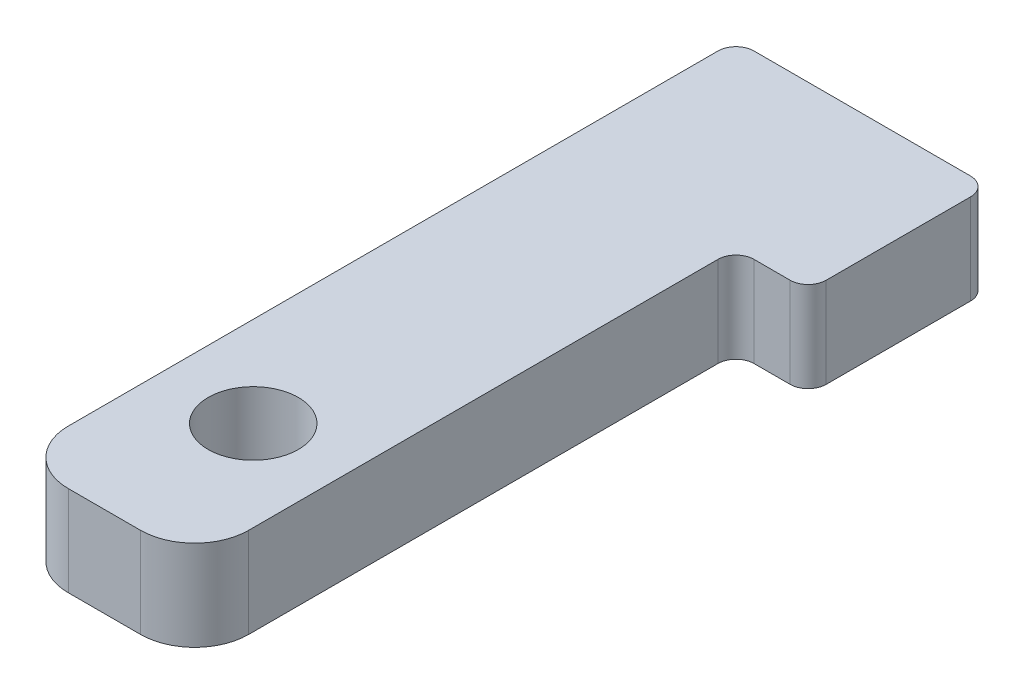
ISO-10303-21;
HEADER;
FILE_DESCRIPTION(('STEP AP214'),'2;1');
FILE_NAME('part.step','',(''),(''),'','','');
FILE_SCHEMA(('AUTOMOTIVE_DESIGN { 1 0 10303 214 1 1 1 1 }'));
ENDSEC;
DATA;
#1=APPLICATION_CONTEXT('core data for automotive mechanical design processes');
#2=APPLICATION_PROTOCOL_DEFINITION('international standard','automotive_design',2000,#1);
#3=PRODUCT_CONTEXT('',#1,'mechanical');
#4=PRODUCT('Part','Part','',(#3));
#5=PRODUCT_RELATED_PRODUCT_CATEGORY('part','',(#4));
#6=PRODUCT_DEFINITION_FORMATION('','',#4);
#7=PRODUCT_DEFINITION_CONTEXT('part definition',#1,'design');
#8=PRODUCT_DEFINITION('design','',#6,#7);
#9=PRODUCT_DEFINITION_SHAPE('','',#8);
#10=(LENGTH_UNIT() NAMED_UNIT(*) SI_UNIT(.MILLI.,.METRE.));
#11=(NAMED_UNIT(*) PLANE_ANGLE_UNIT() SI_UNIT($,.RADIAN.));
#12=(NAMED_UNIT(*) SI_UNIT($,.STERADIAN.) SOLID_ANGLE_UNIT());
#13=UNCERTAINTY_MEASURE_WITH_UNIT(LENGTH_MEASURE(1.E-05),#10,'distance_accuracy_value','');
#14=(GEOMETRIC_REPRESENTATION_CONTEXT(3) GLOBAL_UNCERTAINTY_ASSIGNED_CONTEXT((#13)) GLOBAL_UNIT_ASSIGNED_CONTEXT((#10,
#11,#12)) REPRESENTATION_CONTEXT('',''));
#15=CARTESIAN_POINT('',(0.,0.,0.));
#16=DIRECTION('',(0.,0.,1.));
#17=DIRECTION('',(1.,0.,0.));
#18=AXIS2_PLACEMENT_3D('',#15,#16,#17);
#19=CARTESIAN_POINT('',(10.,5.,-3.00000000000002));
#20=DIRECTION('',(-1.,0.,0.));
#21=DIRECTION('',(0.,0.,1.));
#22=AXIS2_PLACEMENT_3D('',#19,#20,#21);
#23=PLANE('',#22);
#24=DIRECTION('',(0.,1.,0.));
#25=VECTOR('',#24,1.);
#26=CARTESIAN_POINT('',(10.,0.,-29.));
#27=LINE('',#26,#25);
#28=CARTESIAN_POINT('',(10.,0.,-29.));
#29=VERTEX_POINT('',#28);
#30=CARTESIAN_POINT('',(10.,5.,-29.));
#31=VERTEX_POINT('',#30);
#32=EDGE_CURVE('E192',#29,#31,#27,.T.);
#33=ORIENTED_EDGE('',*,*,#32,.T.);
#34=DIRECTION('',(0.,0.,-1.));
#35=VECTOR('',#34,1.);
#36=CARTESIAN_POINT('',(10.,5.,-3.00000000000002));
#37=LINE('',#36,#35);
#38=CARTESIAN_POINT('',(10.,5.,-3.00000000000002));
#39=VERTEX_POINT('',#38);
#40=EDGE_CURVE('E171',#39,#31,#37,.T.);
#41=ORIENTED_EDGE('',*,*,#40,.F.);
#42=DIRECTION('',(0.,-1.,0.));
#43=VECTOR('',#42,1.);
#44=CARTESIAN_POINT('',(10.,5.,-3.00000000000002));
#45=LINE('',#44,#43);
#46=CARTESIAN_POINT('',(10.,0.,-3.00000000000002));
#47=VERTEX_POINT('',#46);
#48=EDGE_CURVE('E172',#39,#47,#45,.T.);
#49=ORIENTED_EDGE('',*,*,#48,.T.);
#50=DIRECTION('',(0.,0.,-1.));
#51=VECTOR('',#50,1.);
#52=CARTESIAN_POINT('',(10.,0.,-3.00000000000002));
#53=LINE('',#52,#51);
#54=EDGE_CURVE('E160',#47,#29,#53,.T.);
#55=ORIENTED_EDGE('',*,*,#54,.T.);
#56=EDGE_LOOP('',(#33,#41,#49,#55));
#57=FACE_BOUND('',#56,.T.);
#58=ADVANCED_FACE('F47',(#57),#23,.F.);
#59=CARTESIAN_POINT('',(3.,5.,-3.));
#60=DIRECTION('',(0.,1.,0.));
#61=DIRECTION('',(0.,0.,1.));
#62=AXIS2_PLACEMENT_3D('',#59,#60,#61);
#63=PLANE('',#62);
#64=CARTESIAN_POINT('',(1.,5.,-39.));
#65=DIRECTION('',(0.,-1.,0.));
#66=DIRECTION('',(0.,0.,-1.));
#67=AXIS2_PLACEMENT_3D('',#64,#65,#66);
#68=CIRCLE('',#67,1.);
#69=CARTESIAN_POINT('',(0.,5.,-39.));
#70=VERTEX_POINT('',#69);
#71=CARTESIAN_POINT('',(1.,5.,-40.));
#72=VERTEX_POINT('',#71);
#73=EDGE_CURVE('E61',#70,#72,#68,.T.);
#74=ORIENTED_EDGE('',*,*,#73,.F.);
#75=DIRECTION('',(0.,0.,1.));
#76=VECTOR('',#75,1.);
#77=CARTESIAN_POINT('',(0.,5.,-3.00000000000002));
#78=LINE('',#77,#76);
#79=CARTESIAN_POINT('',(0.,5.,-3.00000000000002));
#80=VERTEX_POINT('',#79);
#81=EDGE_CURVE('E97',#70,#80,#78,.T.);
#82=ORIENTED_EDGE('',*,*,#81,.T.);
#83=CARTESIAN_POINT('',(3.,5.,-3.));
#84=DIRECTION('',(0.,1.,0.));
#85=DIRECTION('',(0.,0.,1.));
#86=AXIS2_PLACEMENT_3D('',#83,#84,#85);
#87=CIRCLE('',#86,3.);
#88=CARTESIAN_POINT('',(3.,5.,0.));
#89=VERTEX_POINT('',#88);
#90=EDGE_CURVE('E194',#80,#89,#87,.T.);
#91=ORIENTED_EDGE('',*,*,#90,.T.);
#92=DIRECTION('',(1.,0.,0.));
#93=VECTOR('',#92,1.);
#94=CARTESIAN_POINT('',(3.00000000000002,5.,0.));
#95=LINE('',#94,#93);
#96=CARTESIAN_POINT('',(6.99999999999998,5.,0.));
#97=VERTEX_POINT('',#96);
#98=EDGE_CURVE('E181',#89,#97,#95,.T.);
#99=ORIENTED_EDGE('',*,*,#98,.T.);
#100=CARTESIAN_POINT('',(7.,5.,-3.));
#101=DIRECTION('',(0.,1.,0.));
#102=DIRECTION('',(0.,0.,1.));
#103=AXIS2_PLACEMENT_3D('',#100,#101,#102);
#104=CIRCLE('',#103,3.);
#105=EDGE_CURVE('E70',#97,#39,#104,.T.);
#106=ORIENTED_EDGE('',*,*,#105,.T.);
#107=ORIENTED_EDGE('',*,*,#40,.T.);
#108=CARTESIAN_POINT('',(11.,5.,-29.));
#109=DIRECTION('',(0.,-1.,0.));
#110=DIRECTION('',(0.,0.,1.));
#111=AXIS2_PLACEMENT_3D('',#108,#109,#110);
#112=CIRCLE('',#111,1.);
#113=CARTESIAN_POINT('',(11.,5.,-30.));
#114=VERTEX_POINT('',#113);
#115=EDGE_CURVE('E234',#31,#114,#112,.T.);
#116=ORIENTED_EDGE('',*,*,#115,.T.);
#117=DIRECTION('',(1.,0.,0.));
#118=VECTOR('',#117,1.);
#119=CARTESIAN_POINT('',(11.,5.,-30.));
#120=LINE('',#119,#118);
#121=CARTESIAN_POINT('',(13.,5.,-30.));
#122=VERTEX_POINT('',#121);
#123=EDGE_CURVE('E231',#114,#122,#120,.T.);
#124=ORIENTED_EDGE('',*,*,#123,.T.);
#125=CARTESIAN_POINT('',(13.,5.,-31.));
#126=DIRECTION('',(0.,1.,0.));
#127=DIRECTION('',(0.,0.,1.));
#128=AXIS2_PLACEMENT_3D('',#125,#126,#127);
#129=CIRCLE('',#128,0.999999999999997);
#130=CARTESIAN_POINT('',(14.,5.,-31.));
#131=VERTEX_POINT('',#130);
#132=EDGE_CURVE('E228',#122,#131,#129,.T.);
#133=ORIENTED_EDGE('',*,*,#132,.T.);
#134=DIRECTION('',(0.,0.,-1.));
#135=VECTOR('',#134,1.);
#136=CARTESIAN_POINT('',(14.,5.,-31.));
#137=LINE('',#136,#135);
#138=CARTESIAN_POINT('',(14.,5.,-39.));
#139=VERTEX_POINT('',#138);
#140=EDGE_CURVE('E225',#131,#139,#137,.T.);
#141=ORIENTED_EDGE('',*,*,#140,.T.);
#142=CARTESIAN_POINT('',(13.,5.,-39.));
#143=DIRECTION('',(0.,1.,0.));
#144=DIRECTION('',(0.,0.,1.));
#145=AXIS2_PLACEMENT_3D('',#142,#143,#144);
#146=CIRCLE('',#145,1.00000000000002);
#147=CARTESIAN_POINT('',(13.,5.,-40.));
#148=VERTEX_POINT('',#147);
#149=EDGE_CURVE('E222',#139,#148,#146,.T.);
#150=ORIENTED_EDGE('',*,*,#149,.T.);
#151=DIRECTION('',(1.,0.,0.));
#152=VECTOR('',#151,1.);
#153=CARTESIAN_POINT('',(0.,5.,-40.));
#154=LINE('',#153,#152);
#155=EDGE_CURVE('E207',#72,#148,#154,.T.);
#156=ORIENTED_EDGE('',*,*,#155,.F.);
#157=EDGE_LOOP('',(#74,#82,#91,#99,#106,#107,#116,#124,#133,#141,#150,#156));
#158=FACE_BOUND('',#157,.T.);
#159=CARTESIAN_POINT('',(5.,5.,-8.25));
#160=DIRECTION('',(0.,1.,0.));
#161=DIRECTION('',(0.,0.,1.));
#162=AXIS2_PLACEMENT_3D('',#159,#160,#161);
#163=CIRCLE('',#162,2.5);
#164=CARTESIAN_POINT('',(5.,5.,-5.75));
#165=VERTEX_POINT('',#164);
#166=EDGE_CURVE('E165',#165,#165,#163,.T.);
#167=ORIENTED_EDGE('',*,*,#166,.F.);
#168=EDGE_LOOP('',(#167));
#169=FACE_BOUND('',#168,.T.);
#170=ADVANCED_FACE('F254',(#158,#169),#63,.T.);
#171=CARTESIAN_POINT('',(3.,0.,-3.));
#172=DIRECTION('',(0.,1.,0.));
#173=DIRECTION('',(0.,0.,1.));
#174=AXIS2_PLACEMENT_3D('',#171,#172,#173);
#175=PLANE('',#174);
#176=DIRECTION('',(0.,0.,1.));
#177=VECTOR('',#176,1.);
#178=CARTESIAN_POINT('',(0.,0.,-3.00000000000002));
#179=LINE('',#178,#177);
#180=CARTESIAN_POINT('',(0.,0.,-39.));
#181=VERTEX_POINT('',#180);
#182=CARTESIAN_POINT('',(0.,0.,-3.00000000000002));
#183=VERTEX_POINT('',#182);
#184=EDGE_CURVE('E153',#181,#183,#179,.T.);
#185=ORIENTED_EDGE('',*,*,#184,.F.);
#186=CARTESIAN_POINT('',(1.,0.,-39.));
#187=DIRECTION('',(0.,-1.,0.));
#188=DIRECTION('',(0.,0.,-1.));
#189=AXIS2_PLACEMENT_3D('',#186,#187,#188);
#190=CIRCLE('',#189,1.);
#191=CARTESIAN_POINT('',(1.,0.,-40.));
#192=VERTEX_POINT('',#191);
#193=EDGE_CURVE('E143',#181,#192,#190,.T.);
#194=ORIENTED_EDGE('',*,*,#193,.T.);
#195=DIRECTION('',(-1.,0.,0.));
#196=VECTOR('',#195,1.);
#197=CARTESIAN_POINT('',(0.,0.,-40.));
#198=LINE('',#197,#196);
#199=CARTESIAN_POINT('',(13.,0.,-40.));
#200=VERTEX_POINT('',#199);
#201=EDGE_CURVE('E203',#200,#192,#198,.T.);
#202=ORIENTED_EDGE('',*,*,#201,.F.);
#203=CARTESIAN_POINT('',(13.,0.,-39.));
#204=DIRECTION('',(0.,1.,0.));
#205=DIRECTION('',(0.,0.,1.));
#206=AXIS2_PLACEMENT_3D('',#203,#204,#205);
#207=CIRCLE('',#206,1.00000000000002);
#208=CARTESIAN_POINT('',(14.,0.,-39.));
#209=VERTEX_POINT('',#208);
#210=EDGE_CURVE('E212',#209,#200,#207,.T.);
#211=ORIENTED_EDGE('',*,*,#210,.F.);
#212=DIRECTION('',(0.,0.,-1.));
#213=VECTOR('',#212,1.);
#214=CARTESIAN_POINT('',(14.,0.,-31.));
#215=LINE('',#214,#213);
#216=CARTESIAN_POINT('',(14.,0.,-31.));
#217=VERTEX_POINT('',#216);
#218=EDGE_CURVE('E239',#217,#209,#215,.T.);
#219=ORIENTED_EDGE('',*,*,#218,.F.);
#220=CARTESIAN_POINT('',(13.,0.,-31.));
#221=DIRECTION('',(0.,1.,0.));
#222=DIRECTION('',(0.,0.,1.));
#223=AXIS2_PLACEMENT_3D('',#220,#221,#222);
#224=CIRCLE('',#223,0.999999999999997);
#225=CARTESIAN_POINT('',(13.,0.,-30.));
#226=VERTEX_POINT('',#225);
#227=EDGE_CURVE('E242',#226,#217,#224,.T.);
#228=ORIENTED_EDGE('',*,*,#227,.F.);
#229=DIRECTION('',(1.,0.,0.));
#230=VECTOR('',#229,1.);
#231=CARTESIAN_POINT('',(11.,0.,-30.));
#232=LINE('',#231,#230);
#233=CARTESIAN_POINT('',(11.,0.,-30.));
#234=VERTEX_POINT('',#233);
#235=EDGE_CURVE('E245',#234,#226,#232,.T.);
#236=ORIENTED_EDGE('',*,*,#235,.F.);
#237=CARTESIAN_POINT('',(11.,0.,-29.));
#238=DIRECTION('',(0.,-1.,0.));
#239=DIRECTION('',(0.,0.,1.));
#240=AXIS2_PLACEMENT_3D('',#237,#238,#239);
#241=CIRCLE('',#240,1.);
#242=EDGE_CURVE('E188',#29,#234,#241,.T.);
#243=ORIENTED_EDGE('',*,*,#242,.F.);
#244=ORIENTED_EDGE('',*,*,#54,.F.);
#245=CARTESIAN_POINT('',(7.,0.,-3.));
#246=DIRECTION('',(0.,1.,0.));
#247=DIRECTION('',(0.,0.,1.));
#248=AXIS2_PLACEMENT_3D('',#245,#246,#247);
#249=CIRCLE('',#248,3.);
#250=CARTESIAN_POINT('',(6.99999999999998,0.,0.));
#251=VERTEX_POINT('',#250);
#252=EDGE_CURVE('E91',#251,#47,#249,.T.);
#253=ORIENTED_EDGE('',*,*,#252,.F.);
#254=DIRECTION('',(1.,0.,0.));
#255=VECTOR('',#254,1.);
#256=CARTESIAN_POINT('',(3.00000000000002,0.,0.));
#257=LINE('',#256,#255);
#258=CARTESIAN_POINT('',(3.,0.,0.));
#259=VERTEX_POINT('',#258);
#260=EDGE_CURVE('E162',#259,#251,#257,.T.);
#261=ORIENTED_EDGE('',*,*,#260,.F.);
#262=CARTESIAN_POINT('',(3.,0.,-3.));
#263=DIRECTION('',(0.,1.,0.));
#264=DIRECTION('',(0.,0.,1.));
#265=AXIS2_PLACEMENT_3D('',#262,#263,#264);
#266=CIRCLE('',#265,3.);
#267=EDGE_CURVE('E159',#183,#259,#266,.T.);
#268=ORIENTED_EDGE('',*,*,#267,.F.);
#269=EDGE_LOOP('',(#185,#194,#202,#211,#219,#228,#236,#243,#244,#253,#261,#268));
#270=FACE_BOUND('',#269,.T.);
#271=CARTESIAN_POINT('',(5.,0.,-8.25));
#272=DIRECTION('',(0.,1.,0.));
#273=DIRECTION('',(0.,0.,1.));
#274=AXIS2_PLACEMENT_3D('',#271,#272,#273);
#275=CIRCLE('',#274,2.5);
#276=CARTESIAN_POINT('',(5.,0.,-5.75));
#277=VERTEX_POINT('',#276);
#278=EDGE_CURVE('E200',#277,#277,#275,.T.);
#279=ORIENTED_EDGE('',*,*,#278,.T.);
#280=EDGE_LOOP('',(#279));
#281=FACE_BOUND('',#280,.T.);
#282=ADVANCED_FACE('F156',(#270,#281),#175,.F.);
#283=CARTESIAN_POINT('',(0.,5.,-3.00000000000002));
#284=DIRECTION('',(1.,0.,0.));
#285=DIRECTION('',(0.,0.,-1.));
#286=AXIS2_PLACEMENT_3D('',#283,#284,#285);
#287=PLANE('',#286);
#288=DIRECTION('',(0.,-1.,0.));
#289=VECTOR('',#288,1.);
#290=CARTESIAN_POINT('',(0.,5.,-3.00000000000002));
#291=LINE('',#290,#289);
#292=EDGE_CURVE('E11',#80,#183,#291,.T.);
#293=ORIENTED_EDGE('',*,*,#292,.F.);
#294=ORIENTED_EDGE('',*,*,#81,.F.);
#295=DIRECTION('',(0.,1.,0.));
#296=VECTOR('',#295,1.);
#297=CARTESIAN_POINT('',(0.,0.,-39.));
#298=LINE('',#297,#296);
#299=EDGE_CURVE('E146',#181,#70,#298,.T.);
#300=ORIENTED_EDGE('',*,*,#299,.F.);
#301=ORIENTED_EDGE('',*,*,#184,.T.);
#302=EDGE_LOOP('',(#293,#294,#300,#301));
#303=FACE_BOUND('',#302,.T.);
#304=ADVANCED_FACE('F152',(#303),#287,.F.);
#305=CARTESIAN_POINT('',(3.,5.,-3.));
#306=DIRECTION('',(0.,-1.,0.));
#307=DIRECTION('',(0.,0.,-1.));
#308=AXIS2_PLACEMENT_3D('',#305,#306,#307);
#309=CYLINDRICAL_SURFACE('',#308,3.);
#310=ORIENTED_EDGE('',*,*,#267,.T.);
#311=DIRECTION('',(0.,-1.,0.));
#312=VECTOR('',#311,1.);
#313=CARTESIAN_POINT('',(3.,5.,0.));
#314=LINE('',#313,#312);
#315=EDGE_CURVE('E54',#89,#259,#314,.T.);
#316=ORIENTED_EDGE('',*,*,#315,.F.);
#317=ORIENTED_EDGE('',*,*,#90,.F.);
#318=ORIENTED_EDGE('',*,*,#292,.T.);
#319=EDGE_LOOP('',(#310,#316,#317,#318));
#320=FACE_BOUND('',#319,.T.);
#321=ADVANCED_FACE('F300',(#320),#309,.T.);
#322=CARTESIAN_POINT('',(3.00000000000002,5.,0.));
#323=DIRECTION('',(0.,0.,-1.));
#324=DIRECTION('',(-1.,0.,0.));
#325=AXIS2_PLACEMENT_3D('',#322,#323,#324);
#326=PLANE('',#325);
#327=ORIENTED_EDGE('',*,*,#260,.T.);
#328=DIRECTION('',(0.,-1.,0.));
#329=VECTOR('',#328,1.);
#330=CARTESIAN_POINT('',(6.99999999999998,5.,0.));
#331=LINE('',#330,#329);
#332=EDGE_CURVE('E174',#97,#251,#331,.T.);
#333=ORIENTED_EDGE('',*,*,#332,.F.);
#334=ORIENTED_EDGE('',*,*,#98,.F.);
#335=ORIENTED_EDGE('',*,*,#315,.T.);
#336=EDGE_LOOP('',(#327,#333,#334,#335));
#337=FACE_BOUND('',#336,.T.);
#338=ADVANCED_FACE('F179',(#337),#326,.F.);
#339=CARTESIAN_POINT('',(7.,5.,-3.));
#340=DIRECTION('',(0.,-1.,0.));
#341=DIRECTION('',(0.,0.,-1.));
#342=AXIS2_PLACEMENT_3D('',#339,#340,#341);
#343=CYLINDRICAL_SURFACE('',#342,3.);
#344=ORIENTED_EDGE('',*,*,#252,.T.);
#345=ORIENTED_EDGE('',*,*,#48,.F.);
#346=ORIENTED_EDGE('',*,*,#105,.F.);
#347=ORIENTED_EDGE('',*,*,#332,.T.);
#348=EDGE_LOOP('',(#344,#345,#346,#347));
#349=FACE_BOUND('',#348,.T.);
#350=ADVANCED_FACE('F193',(#349),#343,.T.);
#351=CARTESIAN_POINT('',(5.,5.,-8.25));
#352=DIRECTION('',(0.,-1.,0.));
#353=DIRECTION('',(0.,0.,-1.));
#354=AXIS2_PLACEMENT_3D('',#351,#352,#353);
#355=CYLINDRICAL_SURFACE('',#354,2.5);
#356=ORIENTED_EDGE('',*,*,#166,.T.);
#357=EDGE_LOOP('',(#356));
#358=FACE_BOUND('',#357,.T.);
#359=ORIENTED_EDGE('',*,*,#278,.F.);
#360=EDGE_LOOP('',(#359));
#361=FACE_BOUND('',#360,.T.);
#362=ADVANCED_FACE('F281',(#358,#361),#355,.F.);
#363=CARTESIAN_POINT('',(0.,0.,-40.));
#364=DIRECTION('',(0.,0.,-1.));
#365=DIRECTION('',(-1.,0.,0.));
#366=AXIS2_PLACEMENT_3D('',#363,#364,#365);
#367=PLANE('',#366);
#368=ORIENTED_EDGE('',*,*,#201,.T.);
#369=DIRECTION('',(0.,1.,0.));
#370=VECTOR('',#369,1.);
#371=CARTESIAN_POINT('',(1.,0.,-40.));
#372=LINE('',#371,#370);
#373=EDGE_CURVE('E147',#192,#72,#372,.T.);
#374=ORIENTED_EDGE('',*,*,#373,.T.);
#375=ORIENTED_EDGE('',*,*,#155,.T.);
#376=DIRECTION('',(0.,1.,0.));
#377=VECTOR('',#376,1.);
#378=CARTESIAN_POINT('',(13.,0.,-40.));
#379=LINE('',#378,#377);
#380=EDGE_CURVE('E218',#200,#148,#379,.T.);
#381=ORIENTED_EDGE('',*,*,#380,.F.);
#382=EDGE_LOOP('',(#368,#374,#375,#381));
#383=FACE_BOUND('',#382,.T.);
#384=ADVANCED_FACE('F252',(#383),#367,.T.);
#385=CARTESIAN_POINT('',(11.,0.,-29.));
#386=DIRECTION('',(0.,1.,0.));
#387=DIRECTION('',(0.,0.,1.));
#388=AXIS2_PLACEMENT_3D('',#385,#386,#387);
#389=CYLINDRICAL_SURFACE('',#388,1.);
#390=ORIENTED_EDGE('',*,*,#115,.F.);
#391=ORIENTED_EDGE('',*,*,#32,.F.);
#392=ORIENTED_EDGE('',*,*,#242,.T.);
#393=DIRECTION('',(0.,1.,0.));
#394=VECTOR('',#393,1.);
#395=CARTESIAN_POINT('',(11.,0.,-30.));
#396=LINE('',#395,#394);
#397=EDGE_CURVE('E209',#234,#114,#396,.T.);
#398=ORIENTED_EDGE('',*,*,#397,.T.);
#399=EDGE_LOOP('',(#390,#391,#392,#398));
#400=FACE_BOUND('',#399,.T.);
#401=ADVANCED_FACE('F272',(#400),#389,.F.);
#402=CARTESIAN_POINT('',(13.,0.,-39.));
#403=DIRECTION('',(0.,1.,0.));
#404=DIRECTION('',(0.,0.,1.));
#405=AXIS2_PLACEMENT_3D('',#402,#403,#404);
#406=CYLINDRICAL_SURFACE('',#405,1.00000000000002);
#407=ORIENTED_EDGE('',*,*,#149,.F.);
#408=DIRECTION('',(0.,1.,0.));
#409=VECTOR('',#408,1.);
#410=CARTESIAN_POINT('',(14.,0.,-39.));
#411=LINE('',#410,#409);
#412=EDGE_CURVE('E216',#209,#139,#411,.T.);
#413=ORIENTED_EDGE('',*,*,#412,.F.);
#414=ORIENTED_EDGE('',*,*,#210,.T.);
#415=ORIENTED_EDGE('',*,*,#380,.T.);
#416=EDGE_LOOP('',(#407,#413,#414,#415));
#417=FACE_BOUND('',#416,.T.);
#418=ADVANCED_FACE('F259',(#417),#406,.T.);
#419=CARTESIAN_POINT('',(14.,0.,-31.));
#420=DIRECTION('',(1.,0.,0.));
#421=DIRECTION('',(0.,0.,-1.));
#422=AXIS2_PLACEMENT_3D('',#419,#420,#421);
#423=PLANE('',#422);
#424=ORIENTED_EDGE('',*,*,#140,.F.);
#425=DIRECTION('',(0.,1.,0.));
#426=VECTOR('',#425,1.);
#427=CARTESIAN_POINT('',(14.,0.,-31.));
#428=LINE('',#427,#426);
#429=EDGE_CURVE('E214',#217,#131,#428,.T.);
#430=ORIENTED_EDGE('',*,*,#429,.F.);
#431=ORIENTED_EDGE('',*,*,#218,.T.);
#432=ORIENTED_EDGE('',*,*,#412,.T.);
#433=EDGE_LOOP('',(#424,#430,#431,#432));
#434=FACE_BOUND('',#433,.T.);
#435=ADVANCED_FACE('F264',(#434),#423,.T.);
#436=CARTESIAN_POINT('',(13.,0.,-31.));
#437=DIRECTION('',(0.,1.,0.));
#438=DIRECTION('',(0.,0.,1.));
#439=AXIS2_PLACEMENT_3D('',#436,#437,#438);
#440=CYLINDRICAL_SURFACE('',#439,0.999999999999997);
#441=ORIENTED_EDGE('',*,*,#132,.F.);
#442=DIRECTION('',(0.,1.,0.));
#443=VECTOR('',#442,1.);
#444=CARTESIAN_POINT('',(13.,0.,-30.));
#445=LINE('',#444,#443);
#446=EDGE_CURVE('E211',#226,#122,#445,.T.);
#447=ORIENTED_EDGE('',*,*,#446,.F.);
#448=ORIENTED_EDGE('',*,*,#227,.T.);
#449=ORIENTED_EDGE('',*,*,#429,.T.);
#450=EDGE_LOOP('',(#441,#447,#448,#449));
#451=FACE_BOUND('',#450,.T.);
#452=ADVANCED_FACE('F267',(#451),#440,.T.);
#453=CARTESIAN_POINT('',(11.,0.,-30.));
#454=DIRECTION('',(0.,0.,1.));
#455=DIRECTION('',(1.,0.,0.));
#456=AXIS2_PLACEMENT_3D('',#453,#454,#455);
#457=PLANE('',#456);
#458=ORIENTED_EDGE('',*,*,#123,.F.);
#459=ORIENTED_EDGE('',*,*,#397,.F.);
#460=ORIENTED_EDGE('',*,*,#235,.T.);
#461=ORIENTED_EDGE('',*,*,#446,.T.);
#462=EDGE_LOOP('',(#458,#459,#460,#461));
#463=FACE_BOUND('',#462,.T.);
#464=ADVANCED_FACE('F270',(#463),#457,.T.);
#465=CARTESIAN_POINT('',(1.,0.,-39.));
#466=DIRECTION('',(0.,1.,0.));
#467=DIRECTION('',(0.,0.,1.));
#468=AXIS2_PLACEMENT_3D('',#465,#466,#467);
#469=CYLINDRICAL_SURFACE('',#468,1.);
#470=ORIENTED_EDGE('',*,*,#73,.T.);
#471=ORIENTED_EDGE('',*,*,#373,.F.);
#472=ORIENTED_EDGE('',*,*,#193,.F.);
#473=ORIENTED_EDGE('',*,*,#299,.T.);
#474=EDGE_LOOP('',(#470,#471,#472,#473));
#475=FACE_BOUND('',#474,.T.);
#476=ADVANCED_FACE('F145',(#475),#469,.T.);
#477=CLOSED_SHELL('',(#58,#170,#282,#304,#321,#338,#350,#362,#384,#401,#418,#435,#452,#464,#476));
#478=MANIFOLD_SOLID_BREP('B2',#477);
#479=ADVANCED_BREP_SHAPE_REPRESENTATION('',(#18,#478),#14);
#480=SHAPE_DEFINITION_REPRESENTATION(#9,#479);
ENDSEC;
END-ISO-10303-21;
